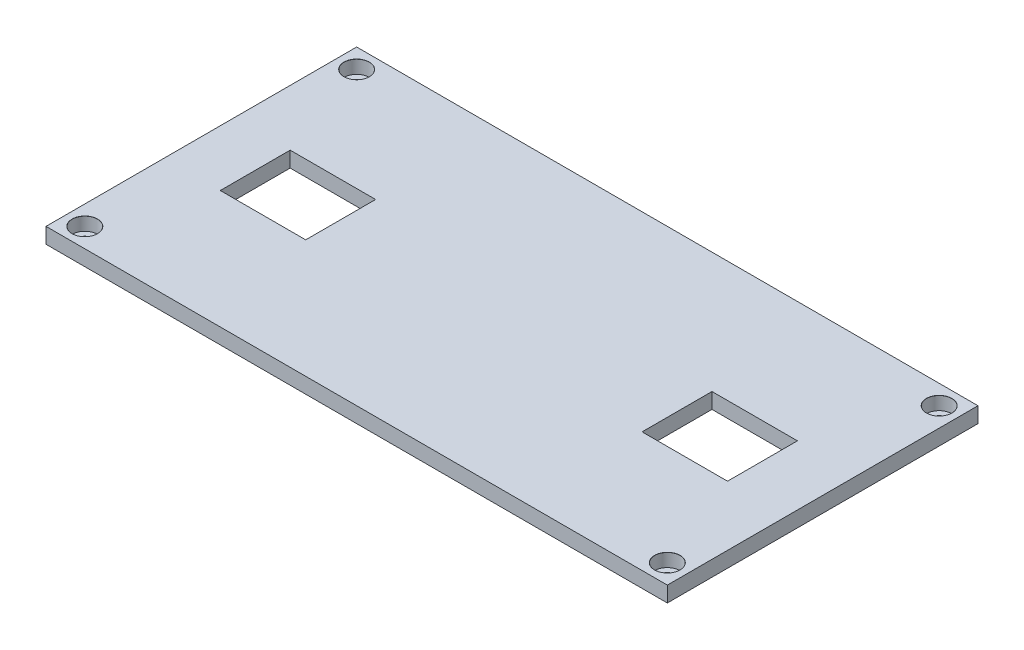
ISO-10303-21;
HEADER;
FILE_DESCRIPTION(('STEP AP214'),'2;1');
FILE_NAME('part.step','',(''),(''),'','','');
FILE_SCHEMA(('AUTOMOTIVE_DESIGN { 1 0 10303 214 1 1 1 1 }'));
ENDSEC;
DATA;
#1=APPLICATION_CONTEXT('core data for automotive mechanical design processes');
#2=APPLICATION_PROTOCOL_DEFINITION('international standard','automotive_design',2000,#1);
#3=PRODUCT_CONTEXT('',#1,'mechanical');
#4=PRODUCT('Part','Part','',(#3));
#5=PRODUCT_RELATED_PRODUCT_CATEGORY('part','',(#4));
#6=PRODUCT_DEFINITION_FORMATION('','',#4);
#7=PRODUCT_DEFINITION_CONTEXT('part definition',#1,'design');
#8=PRODUCT_DEFINITION('design','',#6,#7);
#9=PRODUCT_DEFINITION_SHAPE('','',#8);
#10=(LENGTH_UNIT() NAMED_UNIT(*) SI_UNIT(.MILLI.,.METRE.));
#11=(NAMED_UNIT(*) PLANE_ANGLE_UNIT() SI_UNIT($,.RADIAN.));
#12=(NAMED_UNIT(*) SI_UNIT($,.STERADIAN.) SOLID_ANGLE_UNIT());
#13=UNCERTAINTY_MEASURE_WITH_UNIT(LENGTH_MEASURE(1.E-05),#10,'distance_accuracy_value','');
#14=(GEOMETRIC_REPRESENTATION_CONTEXT(3) GLOBAL_UNCERTAINTY_ASSIGNED_CONTEXT((#13)) GLOBAL_UNIT_ASSIGNED_CONTEXT((#10,
#11,#12)) REPRESENTATION_CONTEXT('',''));
#15=CARTESIAN_POINT('',(0.,0.,0.));
#16=DIRECTION('',(0.,0.,1.));
#17=DIRECTION('',(1.,0.,0.));
#18=AXIS2_PLACEMENT_3D('',#15,#16,#17);
#19=CARTESIAN_POINT('',(-80.,4.,-40.));
#20=DIRECTION('',(0.,0.,-1.));
#21=DIRECTION('',(-1.,0.,0.));
#22=AXIS2_PLACEMENT_3D('',#19,#20,#21);
#23=PLANE('',#22);
#24=DIRECTION('',(1.,0.,0.));
#25=VECTOR('',#24,1.);
#26=CARTESIAN_POINT('',(-80.,0.,-40.));
#27=LINE('',#26,#25);
#28=CARTESIAN_POINT('',(-80.,0.,-40.));
#29=VERTEX_POINT('',#28);
#30=CARTESIAN_POINT('',(80.,0.,-40.));
#31=VERTEX_POINT('',#30);
#32=EDGE_CURVE('E160',#29,#31,#27,.T.);
#33=ORIENTED_EDGE('',*,*,#32,.F.);
#34=DIRECTION('',(0.,-1.,0.));
#35=VECTOR('',#34,1.);
#36=CARTESIAN_POINT('',(-80.,4.,-40.));
#37=LINE('',#36,#35);
#38=CARTESIAN_POINT('',(-80.,4.,-40.));
#39=VERTEX_POINT('',#38);
#40=EDGE_CURVE('E203',#39,#29,#37,.T.);
#41=ORIENTED_EDGE('',*,*,#40,.F.);
#42=DIRECTION('',(1.,0.,0.));
#43=VECTOR('',#42,1.);
#44=CARTESIAN_POINT('',(-80.,4.,-40.));
#45=LINE('',#44,#43);
#46=CARTESIAN_POINT('',(80.,4.,-40.));
#47=VERTEX_POINT('',#46);
#48=EDGE_CURVE('E182',#39,#47,#45,.T.);
#49=ORIENTED_EDGE('',*,*,#48,.T.);
#50=DIRECTION('',(0.,-1.,0.));
#51=VECTOR('',#50,1.);
#52=CARTESIAN_POINT('',(80.,4.,-40.));
#53=LINE('',#52,#51);
#54=EDGE_CURVE('E193',#47,#31,#53,.T.);
#55=ORIENTED_EDGE('',*,*,#54,.T.);
#56=EDGE_LOOP('',(#33,#41,#49,#55));
#57=FACE_BOUND('',#56,.T.);
#58=ADVANCED_FACE('F41',(#57),#23,.T.);
#59=CARTESIAN_POINT('',(-80.,4.,40.));
#60=DIRECTION('',(-1.,0.,0.));
#61=DIRECTION('',(0.,0.,1.));
#62=AXIS2_PLACEMENT_3D('',#59,#60,#61);
#63=PLANE('',#62);
#64=DIRECTION('',(0.,0.,-1.));
#65=VECTOR('',#64,1.);
#66=CARTESIAN_POINT('',(-80.,0.,40.));
#67=LINE('',#66,#65);
#68=CARTESIAN_POINT('',(-80.,0.,40.));
#69=VERTEX_POINT('',#68);
#70=EDGE_CURVE('E186',#69,#29,#67,.T.);
#71=ORIENTED_EDGE('',*,*,#70,.F.);
#72=DIRECTION('',(0.,-1.,0.));
#73=VECTOR('',#72,1.);
#74=CARTESIAN_POINT('',(-80.,4.,40.));
#75=LINE('',#74,#73);
#76=CARTESIAN_POINT('',(-80.,4.,40.));
#77=VERTEX_POINT('',#76);
#78=EDGE_CURVE('E206',#77,#69,#75,.T.);
#79=ORIENTED_EDGE('',*,*,#78,.F.);
#80=DIRECTION('',(0.,0.,-1.));
#81=VECTOR('',#80,1.);
#82=CARTESIAN_POINT('',(-80.,4.,40.));
#83=LINE('',#82,#81);
#84=EDGE_CURVE('E190',#77,#39,#83,.T.);
#85=ORIENTED_EDGE('',*,*,#84,.T.);
#86=ORIENTED_EDGE('',*,*,#40,.T.);
#87=EDGE_LOOP('',(#71,#79,#85,#86));
#88=FACE_BOUND('',#87,.T.);
#89=ADVANCED_FACE('F247',(#88),#63,.T.);
#90=CARTESIAN_POINT('',(-80.,4.,40.));
#91=DIRECTION('',(0.,0.,-1.));
#92=DIRECTION('',(-1.,0.,0.));
#93=AXIS2_PLACEMENT_3D('',#90,#91,#92);
#94=PLANE('',#93);
#95=DIRECTION('',(1.,0.,0.));
#96=VECTOR('',#95,1.);
#97=CARTESIAN_POINT('',(-80.,0.,40.));
#98=LINE('',#97,#96);
#99=CARTESIAN_POINT('',(80.,0.,40.));
#100=VERTEX_POINT('',#99);
#101=EDGE_CURVE('E199',#69,#100,#98,.T.);
#102=ORIENTED_EDGE('',*,*,#101,.T.);
#103=DIRECTION('',(0.,-1.,0.));
#104=VECTOR('',#103,1.);
#105=CARTESIAN_POINT('',(80.,4.,40.));
#106=LINE('',#105,#104);
#107=CARTESIAN_POINT('',(80.,4.,40.));
#108=VERTEX_POINT('',#107);
#109=EDGE_CURVE('E208',#108,#100,#106,.T.);
#110=ORIENTED_EDGE('',*,*,#109,.F.);
#111=DIRECTION('',(1.,0.,0.));
#112=VECTOR('',#111,1.);
#113=CARTESIAN_POINT('',(-80.,4.,40.));
#114=LINE('',#113,#112);
#115=EDGE_CURVE('E188',#77,#108,#114,.T.);
#116=ORIENTED_EDGE('',*,*,#115,.F.);
#117=ORIENTED_EDGE('',*,*,#78,.T.);
#118=EDGE_LOOP('',(#102,#110,#116,#117));
#119=FACE_BOUND('',#118,.T.);
#120=ADVANCED_FACE('F252',(#119),#94,.F.);
#121=CARTESIAN_POINT('',(80.,4.,40.));
#122=DIRECTION('',(-1.,0.,0.));
#123=DIRECTION('',(0.,0.,1.));
#124=AXIS2_PLACEMENT_3D('',#121,#122,#123);
#125=PLANE('',#124);
#126=DIRECTION('',(0.,0.,-1.));
#127=VECTOR('',#126,1.);
#128=CARTESIAN_POINT('',(80.,0.,40.));
#129=LINE('',#128,#127);
#130=EDGE_CURVE('E196',#100,#31,#129,.T.);
#131=ORIENTED_EDGE('',*,*,#130,.T.);
#132=ORIENTED_EDGE('',*,*,#54,.F.);
#133=DIRECTION('',(0.,0.,-1.));
#134=VECTOR('',#133,1.);
#135=CARTESIAN_POINT('',(80.,4.,40.));
#136=LINE('',#135,#134);
#137=EDGE_CURVE('E185',#108,#47,#136,.T.);
#138=ORIENTED_EDGE('',*,*,#137,.F.);
#139=ORIENTED_EDGE('',*,*,#109,.T.);
#140=EDGE_LOOP('',(#131,#132,#138,#139));
#141=FACE_BOUND('',#140,.T.);
#142=ADVANCED_FACE('F268',(#141),#125,.F.);
#143=CARTESIAN_POINT('',(0.,4.,0.));
#144=DIRECTION('',(0.,1.,0.));
#145=DIRECTION('',(0.,0.,1.));
#146=AXIS2_PLACEMENT_3D('',#143,#144,#145);
#147=PLANE('',#146);
#148=CARTESIAN_POINT('',(-75.,4.,-35.));
#149=DIRECTION('',(0.,1.,0.));
#150=DIRECTION('',(0.,0.,1.));
#151=AXIS2_PLACEMENT_3D('',#148,#149,#150);
#152=CIRCLE('',#151,3.275);
#153=CARTESIAN_POINT('',(-75.,4.,-31.725));
#154=VERTEX_POINT('',#153);
#155=EDGE_CURVE('E511',#154,#154,#152,.T.);
#156=ORIENTED_EDGE('',*,*,#155,.F.);
#157=EDGE_LOOP('',(#156));
#158=FACE_BOUND('',#157,.T.);
#159=CARTESIAN_POINT('',(75.,4.,-35.));
#160=DIRECTION('',(0.,1.,0.));
#161=DIRECTION('',(0.,0.,1.));
#162=AXIS2_PLACEMENT_3D('',#159,#160,#161);
#163=CIRCLE('',#162,3.275);
#164=CARTESIAN_POINT('',(75.,4.,-31.725));
#165=VERTEX_POINT('',#164);
#166=EDGE_CURVE('E524',#165,#165,#163,.T.);
#167=ORIENTED_EDGE('',*,*,#166,.F.);
#168=EDGE_LOOP('',(#167));
#169=FACE_BOUND('',#168,.T.);
#170=CARTESIAN_POINT('',(75.,4.,35.));
#171=DIRECTION('',(0.,1.,0.));
#172=DIRECTION('',(0.,0.,1.));
#173=AXIS2_PLACEMENT_3D('',#170,#171,#172);
#174=CIRCLE('',#173,3.275);
#175=CARTESIAN_POINT('',(75.,4.,38.275));
#176=VERTEX_POINT('',#175);
#177=EDGE_CURVE('E539',#176,#176,#174,.T.);
#178=ORIENTED_EDGE('',*,*,#177,.F.);
#179=EDGE_LOOP('',(#178));
#180=FACE_BOUND('',#179,.T.);
#181=CARTESIAN_POINT('',(-75.,4.,35.));
#182=DIRECTION('',(0.,1.,0.));
#183=DIRECTION('',(0.,0.,1.));
#184=AXIS2_PLACEMENT_3D('',#181,#182,#183);
#185=CIRCLE('',#184,3.275);
#186=CARTESIAN_POINT('',(-75.,4.,38.275));
#187=VERTEX_POINT('',#186);
#188=EDGE_CURVE('E554',#187,#187,#185,.T.);
#189=ORIENTED_EDGE('',*,*,#188,.F.);
#190=EDGE_LOOP('',(#189));
#191=FACE_BOUND('',#190,.T.);
#192=DIRECTION('',(0.,0.,-1.));
#193=VECTOR('',#192,1.);
#194=CARTESIAN_POINT('',(-43.5539718881802,4.,9.56827054050187));
#195=LINE('',#194,#193);
#196=CARTESIAN_POINT('',(-43.5539718881802,4.,9.56827054050187));
#197=VERTEX_POINT('',#196);
#198=CARTESIAN_POINT('',(-43.5539718881802,4.,-8.43172945949813));
#199=VERTEX_POINT('',#198);
#200=EDGE_CURVE('E55',#197,#199,#195,.T.);
#201=ORIENTED_EDGE('',*,*,#200,.F.);
#202=DIRECTION('',(1.,0.,0.));
#203=VECTOR('',#202,1.);
#204=CARTESIAN_POINT('',(-43.5539718881802,4.,9.56827054050187));
#205=LINE('',#204,#203);
#206=CARTESIAN_POINT('',(-65.5539718881802,4.,9.56827054050187));
#207=VERTEX_POINT('',#206);
#208=EDGE_CURVE('E153',#207,#197,#205,.T.);
#209=ORIENTED_EDGE('',*,*,#208,.F.);
#210=DIRECTION('',(0.,0.,1.));
#211=VECTOR('',#210,1.);
#212=CARTESIAN_POINT('',(-65.5539718881802,4.,9.56827054050187));
#213=LINE('',#212,#211);
#214=CARTESIAN_POINT('',(-65.5539718881802,4.,-8.43172945949813));
#215=VERTEX_POINT('',#214);
#216=EDGE_CURVE('E136',#215,#207,#213,.T.);
#217=ORIENTED_EDGE('',*,*,#216,.F.);
#218=DIRECTION('',(-1.,0.,0.));
#219=VECTOR('',#218,1.);
#220=CARTESIAN_POINT('',(-43.5539718881802,4.,-8.43172945949813));
#221=LINE('',#220,#219);
#222=EDGE_CURVE('E146',#199,#215,#221,.T.);
#223=ORIENTED_EDGE('',*,*,#222,.F.);
#224=EDGE_LOOP('',(#201,#209,#217,#223));
#225=FACE_BOUND('',#224,.T.);
#226=DIRECTION('',(0.,0.,-1.));
#227=VECTOR('',#226,1.);
#228=CARTESIAN_POINT('',(64.5797938187484,4.,9.08118150578598));
#229=LINE('',#228,#227);
#230=CARTESIAN_POINT('',(64.5797938187484,4.,9.08118150578598));
#231=VERTEX_POINT('',#230);
#232=CARTESIAN_POINT('',(64.5797938187484,4.,-8.91881849421402));
#233=VERTEX_POINT('',#232);
#234=EDGE_CURVE('E63',#231,#233,#229,.T.);
#235=ORIENTED_EDGE('',*,*,#234,.F.);
#236=DIRECTION('',(1.,0.,0.));
#237=VECTOR('',#236,1.);
#238=CARTESIAN_POINT('',(64.5797938187484,4.,9.08118150578598));
#239=LINE('',#238,#237);
#240=CARTESIAN_POINT('',(42.5797938187484,4.,9.08118150578598));
#241=VERTEX_POINT('',#240);
#242=EDGE_CURVE('E165',#241,#231,#239,.T.);
#243=ORIENTED_EDGE('',*,*,#242,.F.);
#244=DIRECTION('',(0.,0.,1.));
#245=VECTOR('',#244,1.);
#246=CARTESIAN_POINT('',(42.5797938187484,4.,9.08118150578598));
#247=LINE('',#246,#245);
#248=CARTESIAN_POINT('',(42.5797938187484,4.,-8.91881849421402));
#249=VERTEX_POINT('',#248);
#250=EDGE_CURVE('E175',#249,#241,#247,.T.);
#251=ORIENTED_EDGE('',*,*,#250,.F.);
#252=DIRECTION('',(-1.,0.,0.));
#253=VECTOR('',#252,1.);
#254=CARTESIAN_POINT('',(64.5797938187484,4.,-8.91881849421402));
#255=LINE('',#254,#253);
#256=EDGE_CURVE('E178',#233,#249,#255,.T.);
#257=ORIENTED_EDGE('',*,*,#256,.F.);
#258=EDGE_LOOP('',(#235,#243,#251,#257));
#259=FACE_BOUND('',#258,.T.);
#260=ORIENTED_EDGE('',*,*,#48,.F.);
#261=ORIENTED_EDGE('',*,*,#84,.F.);
#262=ORIENTED_EDGE('',*,*,#115,.T.);
#263=ORIENTED_EDGE('',*,*,#137,.T.);
#264=EDGE_LOOP('',(#260,#261,#262,#263));
#265=FACE_BOUND('',#264,.T.);
#266=ADVANCED_FACE('F150',(#158,#169,#180,#191,#225,#259,#265),#147,.T.);
#267=CARTESIAN_POINT('',(0.,0.,0.));
#268=DIRECTION('',(0.,1.,0.));
#269=DIRECTION('',(0.,0.,1.));
#270=AXIS2_PLACEMENT_3D('',#267,#268,#269);
#271=PLANE('',#270);
#272=CARTESIAN_POINT('',(-75.,0.,-35.));
#273=DIRECTION('',(0.,1.,0.));
#274=DIRECTION('',(0.,0.,1.));
#275=AXIS2_PLACEMENT_3D('',#272,#273,#274);
#276=CIRCLE('',#275,1.69999999999999);
#277=CARTESIAN_POINT('',(-75.,0.,-33.3));
#278=VERTEX_POINT('',#277);
#279=EDGE_CURVE('E521',#278,#278,#276,.T.);
#280=ORIENTED_EDGE('',*,*,#279,.T.);
#281=EDGE_LOOP('',(#280));
#282=FACE_BOUND('',#281,.T.);
#283=CARTESIAN_POINT('',(75.,0.,-35.));
#284=DIRECTION('',(0.,1.,0.));
#285=DIRECTION('',(0.,0.,1.));
#286=AXIS2_PLACEMENT_3D('',#283,#284,#285);
#287=CIRCLE('',#286,1.69999999999999);
#288=CARTESIAN_POINT('',(75.,0.,-33.3));
#289=VERTEX_POINT('',#288);
#290=EDGE_CURVE('E536',#289,#289,#287,.T.);
#291=ORIENTED_EDGE('',*,*,#290,.T.);
#292=EDGE_LOOP('',(#291));
#293=FACE_BOUND('',#292,.T.);
#294=CARTESIAN_POINT('',(75.,0.,35.));
#295=DIRECTION('',(0.,1.,0.));
#296=DIRECTION('',(0.,0.,1.));
#297=AXIS2_PLACEMENT_3D('',#294,#295,#296);
#298=CIRCLE('',#297,1.69999999999999);
#299=CARTESIAN_POINT('',(75.,0.,36.7));
#300=VERTEX_POINT('',#299);
#301=EDGE_CURVE('E551',#300,#300,#298,.T.);
#302=ORIENTED_EDGE('',*,*,#301,.T.);
#303=EDGE_LOOP('',(#302));
#304=FACE_BOUND('',#303,.T.);
#305=CARTESIAN_POINT('',(-75.,0.,35.));
#306=DIRECTION('',(0.,1.,0.));
#307=DIRECTION('',(0.,0.,1.));
#308=AXIS2_PLACEMENT_3D('',#305,#306,#307);
#309=CIRCLE('',#308,1.69999999999999);
#310=CARTESIAN_POINT('',(-75.,0.,36.7));
#311=VERTEX_POINT('',#310);
#312=EDGE_CURVE('E172',#311,#311,#309,.T.);
#313=ORIENTED_EDGE('',*,*,#312,.T.);
#314=EDGE_LOOP('',(#313));
#315=FACE_BOUND('',#314,.T.);
#316=DIRECTION('',(1.,0.,0.));
#317=VECTOR('',#316,1.);
#318=CARTESIAN_POINT('',(0.,0.,9.56827054050187));
#319=LINE('',#318,#317);
#320=CARTESIAN_POINT('',(-65.5539718881802,0.,9.56827054050187));
#321=VERTEX_POINT('',#320);
#322=CARTESIAN_POINT('',(-43.5539718881802,0.,9.56827054050187));
#323=VERTEX_POINT('',#322);
#324=EDGE_CURVE('E48',#321,#323,#319,.T.);
#325=ORIENTED_EDGE('',*,*,#324,.T.);
#326=DIRECTION('',(0.,0.,-1.));
#327=VECTOR('',#326,1.);
#328=CARTESIAN_POINT('',(-43.5539718881802,0.,0.));
#329=LINE('',#328,#327);
#330=CARTESIAN_POINT('',(-43.5539718881802,0.,-8.43172945949813));
#331=VERTEX_POINT('',#330);
#332=EDGE_CURVE('E11',#323,#331,#329,.T.);
#333=ORIENTED_EDGE('',*,*,#332,.T.);
#334=DIRECTION('',(-1.,0.,0.));
#335=VECTOR('',#334,1.);
#336=CARTESIAN_POINT('',(0.,0.,-8.43172945949813));
#337=LINE('',#336,#335);
#338=CARTESIAN_POINT('',(-65.5539718881802,0.,-8.43172945949813));
#339=VERTEX_POINT('',#338);
#340=EDGE_CURVE('E223',#331,#339,#337,.T.);
#341=ORIENTED_EDGE('',*,*,#340,.T.);
#342=DIRECTION('',(0.,0.,1.));
#343=VECTOR('',#342,1.);
#344=CARTESIAN_POINT('',(-65.5539718881802,0.,0.));
#345=LINE('',#344,#343);
#346=EDGE_CURVE('E139',#339,#321,#345,.T.);
#347=ORIENTED_EDGE('',*,*,#346,.T.);
#348=EDGE_LOOP('',(#325,#333,#341,#347));
#349=FACE_BOUND('',#348,.T.);
#350=DIRECTION('',(1.,0.,0.));
#351=VECTOR('',#350,1.);
#352=CARTESIAN_POINT('',(0.,0.,9.08118150578598));
#353=LINE('',#352,#351);
#354=CARTESIAN_POINT('',(42.5797938187484,0.,9.08118150578598));
#355=VERTEX_POINT('',#354);
#356=CARTESIAN_POINT('',(64.5797938187484,0.,9.08118150578598));
#357=VERTEX_POINT('',#356);
#358=EDGE_CURVE('E217',#355,#357,#353,.T.);
#359=ORIENTED_EDGE('',*,*,#358,.T.);
#360=DIRECTION('',(0.,0.,-1.));
#361=VECTOR('',#360,1.);
#362=CARTESIAN_POINT('',(64.5797938187484,0.,0.));
#363=LINE('',#362,#361);
#364=CARTESIAN_POINT('',(64.5797938187484,0.,-8.91881849421402));
#365=VERTEX_POINT('',#364);
#366=EDGE_CURVE('E220',#357,#365,#363,.T.);
#367=ORIENTED_EDGE('',*,*,#366,.T.);
#368=DIRECTION('',(-1.,0.,0.));
#369=VECTOR('',#368,1.);
#370=CARTESIAN_POINT('',(0.,0.,-8.91881849421402));
#371=LINE('',#370,#369);
#372=CARTESIAN_POINT('',(42.5797938187484,0.,-8.91881849421402));
#373=VERTEX_POINT('',#372);
#374=EDGE_CURVE('E205',#365,#373,#371,.T.);
#375=ORIENTED_EDGE('',*,*,#374,.T.);
#376=DIRECTION('',(0.,0.,1.));
#377=VECTOR('',#376,1.);
#378=CARTESIAN_POINT('',(42.5797938187484,0.,0.));
#379=LINE('',#378,#377);
#380=EDGE_CURVE('E214',#373,#355,#379,.T.);
#381=ORIENTED_EDGE('',*,*,#380,.T.);
#382=EDGE_LOOP('',(#359,#367,#375,#381));
#383=FACE_BOUND('',#382,.T.);
#384=ORIENTED_EDGE('',*,*,#32,.T.);
#385=ORIENTED_EDGE('',*,*,#130,.F.);
#386=ORIENTED_EDGE('',*,*,#101,.F.);
#387=ORIENTED_EDGE('',*,*,#70,.T.);
#388=EDGE_LOOP('',(#384,#385,#386,#387));
#389=FACE_BOUND('',#388,.T.);
#390=ADVANCED_FACE('F227',(#282,#293,#304,#315,#349,#383,#389),#271,.F.);
#391=CARTESIAN_POINT('',(64.5797938187484,-7.,9.08118150578598));
#392=DIRECTION('',(1.,0.,0.));
#393=DIRECTION('',(0.,0.,-1.));
#394=AXIS2_PLACEMENT_3D('',#391,#392,#393);
#395=PLANE('',#394);
#396=DIRECTION('',(0.,1.,0.));
#397=VECTOR('',#396,1.);
#398=CARTESIAN_POINT('',(64.5797938187484,-7.,9.08118150578598));
#399=LINE('',#398,#397);
#400=EDGE_CURVE('E170',#357,#231,#399,.T.);
#401=ORIENTED_EDGE('',*,*,#400,.T.);
#402=ORIENTED_EDGE('',*,*,#234,.T.);
#403=DIRECTION('',(0.,1.,0.));
#404=VECTOR('',#403,1.);
#405=CARTESIAN_POINT('',(64.5797938187484,-7.,-8.91881849421402));
#406=LINE('',#405,#404);
#407=EDGE_CURVE('E163',#365,#233,#406,.T.);
#408=ORIENTED_EDGE('',*,*,#407,.F.);
#409=ORIENTED_EDGE('',*,*,#366,.F.);
#410=EDGE_LOOP('',(#401,#402,#408,#409));
#411=FACE_BOUND('',#410,.T.);
#412=ADVANCED_FACE('F278',(#411),#395,.F.);
#413=CARTESIAN_POINT('',(64.5797938187484,-7.,9.08118150578598));
#414=DIRECTION('',(0.,0.,1.));
#415=DIRECTION('',(1.,0.,0.));
#416=AXIS2_PLACEMENT_3D('',#413,#414,#415);
#417=PLANE('',#416);
#418=DIRECTION('',(0.,1.,0.));
#419=VECTOR('',#418,1.);
#420=CARTESIAN_POINT('',(42.5797938187484,-7.,9.08118150578598));
#421=LINE('',#420,#419);
#422=EDGE_CURVE('E168',#355,#241,#421,.T.);
#423=ORIENTED_EDGE('',*,*,#422,.T.);
#424=ORIENTED_EDGE('',*,*,#242,.T.);
#425=ORIENTED_EDGE('',*,*,#400,.F.);
#426=ORIENTED_EDGE('',*,*,#358,.F.);
#427=EDGE_LOOP('',(#423,#424,#425,#426));
#428=FACE_BOUND('',#427,.T.);
#429=ADVANCED_FACE('F283',(#428),#417,.F.);
#430=CARTESIAN_POINT('',(42.5797938187484,-7.,9.08118150578598));
#431=DIRECTION('',(-1.,0.,0.));
#432=DIRECTION('',(0.,0.,1.));
#433=AXIS2_PLACEMENT_3D('',#430,#431,#432);
#434=PLANE('',#433);
#435=DIRECTION('',(0.,1.,0.));
#436=VECTOR('',#435,1.);
#437=CARTESIAN_POINT('',(42.5797938187484,-7.,-8.91881849421402));
#438=LINE('',#437,#436);
#439=EDGE_CURVE('E166',#373,#249,#438,.T.);
#440=ORIENTED_EDGE('',*,*,#439,.T.);
#441=ORIENTED_EDGE('',*,*,#250,.T.);
#442=ORIENTED_EDGE('',*,*,#422,.F.);
#443=ORIENTED_EDGE('',*,*,#380,.F.);
#444=EDGE_LOOP('',(#440,#441,#442,#443));
#445=FACE_BOUND('',#444,.T.);
#446=ADVANCED_FACE('F241',(#445),#434,.F.);
#447=CARTESIAN_POINT('',(64.5797938187484,-7.,-8.91881849421402));
#448=DIRECTION('',(0.,0.,-1.));
#449=DIRECTION('',(-1.,0.,0.));
#450=AXIS2_PLACEMENT_3D('',#447,#448,#449);
#451=PLANE('',#450);
#452=ORIENTED_EDGE('',*,*,#407,.T.);
#453=ORIENTED_EDGE('',*,*,#256,.T.);
#454=ORIENTED_EDGE('',*,*,#439,.F.);
#455=ORIENTED_EDGE('',*,*,#374,.F.);
#456=EDGE_LOOP('',(#452,#453,#454,#455));
#457=FACE_BOUND('',#456,.T.);
#458=ADVANCED_FACE('F234',(#457),#451,.F.);
#459=CARTESIAN_POINT('',(-43.5539718881802,-7.,9.56827054050187));
#460=DIRECTION('',(1.,0.,0.));
#461=DIRECTION('',(0.,0.,-1.));
#462=AXIS2_PLACEMENT_3D('',#459,#460,#461);
#463=PLANE('',#462);
#464=DIRECTION('',(0.,1.,0.));
#465=VECTOR('',#464,1.);
#466=CARTESIAN_POINT('',(-43.5539718881802,-7.,9.56827054050187));
#467=LINE('',#466,#465);
#468=EDGE_CURVE('E158',#323,#197,#467,.T.);
#469=ORIENTED_EDGE('',*,*,#468,.T.);
#470=ORIENTED_EDGE('',*,*,#200,.T.);
#471=DIRECTION('',(0.,1.,0.));
#472=VECTOR('',#471,1.);
#473=CARTESIAN_POINT('',(-43.5539718881802,-7.,-8.43172945949813));
#474=LINE('',#473,#472);
#475=EDGE_CURVE('E143',#331,#199,#474,.T.);
#476=ORIENTED_EDGE('',*,*,#475,.F.);
#477=ORIENTED_EDGE('',*,*,#332,.F.);
#478=EDGE_LOOP('',(#469,#470,#476,#477));
#479=FACE_BOUND('',#478,.T.);
#480=ADVANCED_FACE('F232',(#479),#463,.F.);
#481=CARTESIAN_POINT('',(-43.5539718881802,-7.,9.56827054050187));
#482=DIRECTION('',(0.,0.,1.));
#483=DIRECTION('',(1.,0.,0.));
#484=AXIS2_PLACEMENT_3D('',#481,#482,#483);
#485=PLANE('',#484);
#486=DIRECTION('',(0.,1.,0.));
#487=VECTOR('',#486,1.);
#488=CARTESIAN_POINT('',(-65.5539718881802,-7.,9.56827054050187));
#489=LINE('',#488,#487);
#490=EDGE_CURVE('E142',#321,#207,#489,.T.);
#491=ORIENTED_EDGE('',*,*,#490,.T.);
#492=ORIENTED_EDGE('',*,*,#208,.T.);
#493=ORIENTED_EDGE('',*,*,#468,.F.);
#494=ORIENTED_EDGE('',*,*,#324,.F.);
#495=EDGE_LOOP('',(#491,#492,#493,#494));
#496=FACE_BOUND('',#495,.T.);
#497=ADVANCED_FACE('F231',(#496),#485,.F.);
#498=CARTESIAN_POINT('',(-65.5539718881802,-7.,9.56827054050187));
#499=DIRECTION('',(-1.,0.,0.));
#500=DIRECTION('',(0.,0.,1.));
#501=AXIS2_PLACEMENT_3D('',#498,#499,#500);
#502=PLANE('',#501);
#503=DIRECTION('',(0.,1.,0.));
#504=VECTOR('',#503,1.);
#505=CARTESIAN_POINT('',(-65.5539718881802,-7.,-8.43172945949813));
#506=LINE('',#505,#504);
#507=EDGE_CURVE('E131',#339,#215,#506,.T.);
#508=ORIENTED_EDGE('',*,*,#507,.T.);
#509=ORIENTED_EDGE('',*,*,#216,.T.);
#510=ORIENTED_EDGE('',*,*,#490,.F.);
#511=ORIENTED_EDGE('',*,*,#346,.F.);
#512=EDGE_LOOP('',(#508,#509,#510,#511));
#513=FACE_BOUND('',#512,.T.);
#514=ADVANCED_FACE('F133',(#513),#502,.F.);
#515=CARTESIAN_POINT('',(-43.5539718881802,-7.,-8.43172945949813));
#516=DIRECTION('',(0.,0.,-1.));
#517=DIRECTION('',(-1.,0.,0.));
#518=AXIS2_PLACEMENT_3D('',#515,#516,#517);
#519=PLANE('',#518);
#520=ORIENTED_EDGE('',*,*,#475,.T.);
#521=ORIENTED_EDGE('',*,*,#222,.T.);
#522=ORIENTED_EDGE('',*,*,#507,.F.);
#523=ORIENTED_EDGE('',*,*,#340,.F.);
#524=EDGE_LOOP('',(#520,#521,#522,#523));
#525=FACE_BOUND('',#524,.T.);
#526=ADVANCED_FACE('F147',(#525),#519,.F.);
#527=CARTESIAN_POINT('',(-75.,4.,35.));
#528=DIRECTION('',(0.,1.,0.));
#529=DIRECTION('',(0.,0.,1.));
#530=AXIS2_PLACEMENT_3D('',#527,#528,#529);
#531=CYLINDRICAL_SURFACE('',#530,1.69999999999999);
#532=ORIENTED_EDGE('',*,*,#312,.F.);
#533=EDGE_LOOP('',(#532));
#534=FACE_BOUND('',#533,.T.);
#535=CARTESIAN_POINT('',(-75.,0.600000000000001,35.));
#536=DIRECTION('',(0.,1.,0.));
#537=DIRECTION('',(0.,0.,1.));
#538=AXIS2_PLACEMENT_3D('',#535,#536,#537);
#539=CIRCLE('',#538,1.69999999999999);
#540=CARTESIAN_POINT('',(-75.,0.600000000000001,36.7));
#541=VERTEX_POINT('',#540);
#542=EDGE_CURVE('E563',#541,#541,#539,.T.);
#543=ORIENTED_EDGE('',*,*,#542,.T.);
#544=EDGE_LOOP('',(#543));
#545=FACE_BOUND('',#544,.T.);
#546=ADVANCED_FACE('F344',(#534,#545),#531,.F.);
#547=CARTESIAN_POINT('',(-71.75,0.600000000000001,35.));
#548=DIRECTION('',(0.,-1.,0.));
#549=DIRECTION('',(0.,0.,-1.));
#550=AXIS2_PLACEMENT_3D('',#547,#548,#549);
#551=PLANE('',#550);
#552=ORIENTED_EDGE('',*,*,#542,.F.);
#553=EDGE_LOOP('',(#552));
#554=FACE_BOUND('',#553,.T.);
#555=CARTESIAN_POINT('',(-75.,0.600000000000001,35.));
#556=DIRECTION('',(0.,1.,0.));
#557=DIRECTION('',(0.,0.,1.));
#558=AXIS2_PLACEMENT_3D('',#555,#556,#557);
#559=CIRCLE('',#558,3.25);
#560=CARTESIAN_POINT('',(-75.,0.600000000000001,38.25));
#561=VERTEX_POINT('',#560);
#562=EDGE_CURVE('E560',#561,#561,#559,.T.);
#563=ORIENTED_EDGE('',*,*,#562,.T.);
#564=EDGE_LOOP('',(#563));
#565=FACE_BOUND('',#564,.T.);
#566=ADVANCED_FACE('F352',(#554,#565),#551,.F.);
#567=CARTESIAN_POINT('',(-75.,4.,35.));
#568=DIRECTION('',(0.,1.,0.));
#569=DIRECTION('',(0.,0.,1.));
#570=AXIS2_PLACEMENT_3D('',#567,#568,#569);
#571=CYLINDRICAL_SURFACE('',#570,3.25);
#572=ORIENTED_EDGE('',*,*,#562,.F.);
#573=EDGE_LOOP('',(#572));
#574=FACE_BOUND('',#573,.T.);
#575=CARTESIAN_POINT('',(-75.,3.975,35.));
#576=DIRECTION('',(0.,1.,0.));
#577=DIRECTION('',(0.,0.,1.));
#578=AXIS2_PLACEMENT_3D('',#575,#576,#577);
#579=CIRCLE('',#578,3.25);
#580=CARTESIAN_POINT('',(-75.,3.975,38.25));
#581=VERTEX_POINT('',#580);
#582=EDGE_CURVE('E557',#581,#581,#579,.T.);
#583=ORIENTED_EDGE('',*,*,#582,.T.);
#584=EDGE_LOOP('',(#583));
#585=FACE_BOUND('',#584,.T.);
#586=ADVANCED_FACE('F362',(#574,#585),#571,.F.);
#587=CARTESIAN_POINT('',(-75.,4.,35.));
#588=DIRECTION('',(0.,1.,0.));
#589=DIRECTION('',(0.,0.,1.));
#590=AXIS2_PLACEMENT_3D('',#587,#588,#589);
#591=CONICAL_SURFACE('',#590,3.275,0.785398163397379);
#592=ORIENTED_EDGE('',*,*,#582,.F.);
#593=EDGE_LOOP('',(#592));
#594=FACE_BOUND('',#593,.T.);
#595=ORIENTED_EDGE('',*,*,#188,.T.);
#596=EDGE_LOOP('',(#595));
#597=FACE_BOUND('',#596,.T.);
#598=ADVANCED_FACE('F372',(#594,#597),#591,.F.);
#599=CARTESIAN_POINT('',(75.,4.,35.));
#600=DIRECTION('',(0.,1.,0.));
#601=DIRECTION('',(0.,0.,1.));
#602=AXIS2_PLACEMENT_3D('',#599,#600,#601);
#603=CYLINDRICAL_SURFACE('',#602,1.69999999999999);
#604=ORIENTED_EDGE('',*,*,#301,.F.);
#605=EDGE_LOOP('',(#604));
#606=FACE_BOUND('',#605,.T.);
#607=CARTESIAN_POINT('',(75.,0.600000000000001,35.));
#608=DIRECTION('',(0.,1.,0.));
#609=DIRECTION('',(0.,0.,1.));
#610=AXIS2_PLACEMENT_3D('',#607,#608,#609);
#611=CIRCLE('',#610,1.69999999999999);
#612=CARTESIAN_POINT('',(75.,0.600000000000001,36.7));
#613=VERTEX_POINT('',#612);
#614=EDGE_CURVE('E548',#613,#613,#611,.T.);
#615=ORIENTED_EDGE('',*,*,#614,.T.);
#616=EDGE_LOOP('',(#615));
#617=FACE_BOUND('',#616,.T.);
#618=ADVANCED_FACE('F382',(#606,#617),#603,.F.);
#619=CARTESIAN_POINT('',(78.25,0.600000000000001,35.));
#620=DIRECTION('',(0.,-1.,0.));
#621=DIRECTION('',(0.,0.,-1.));
#622=AXIS2_PLACEMENT_3D('',#619,#620,#621);
#623=PLANE('',#622);
#624=ORIENTED_EDGE('',*,*,#614,.F.);
#625=EDGE_LOOP('',(#624));
#626=FACE_BOUND('',#625,.T.);
#627=CARTESIAN_POINT('',(75.,0.600000000000001,35.));
#628=DIRECTION('',(0.,1.,0.));
#629=DIRECTION('',(0.,0.,1.));
#630=AXIS2_PLACEMENT_3D('',#627,#628,#629);
#631=CIRCLE('',#630,3.25);
#632=CARTESIAN_POINT('',(75.,0.600000000000001,38.25));
#633=VERTEX_POINT('',#632);
#634=EDGE_CURVE('E545',#633,#633,#631,.T.);
#635=ORIENTED_EDGE('',*,*,#634,.T.);
#636=EDGE_LOOP('',(#635));
#637=FACE_BOUND('',#636,.T.);
#638=ADVANCED_FACE('F392',(#626,#637),#623,.F.);
#639=CARTESIAN_POINT('',(75.,4.,35.));
#640=DIRECTION('',(0.,1.,0.));
#641=DIRECTION('',(0.,0.,1.));
#642=AXIS2_PLACEMENT_3D('',#639,#640,#641);
#643=CYLINDRICAL_SURFACE('',#642,3.25);
#644=ORIENTED_EDGE('',*,*,#634,.F.);
#645=EDGE_LOOP('',(#644));
#646=FACE_BOUND('',#645,.T.);
#647=CARTESIAN_POINT('',(75.,3.975,35.));
#648=DIRECTION('',(0.,1.,0.));
#649=DIRECTION('',(0.,0.,1.));
#650=AXIS2_PLACEMENT_3D('',#647,#648,#649);
#651=CIRCLE('',#650,3.25);
#652=CARTESIAN_POINT('',(75.,3.975,38.25));
#653=VERTEX_POINT('',#652);
#654=EDGE_CURVE('E542',#653,#653,#651,.T.);
#655=ORIENTED_EDGE('',*,*,#654,.T.);
#656=EDGE_LOOP('',(#655));
#657=FACE_BOUND('',#656,.T.);
#658=ADVANCED_FACE('F402',(#646,#657),#643,.F.);
#659=CARTESIAN_POINT('',(75.,4.,35.));
#660=DIRECTION('',(0.,1.,0.));
#661=DIRECTION('',(0.,0.,1.));
#662=AXIS2_PLACEMENT_3D('',#659,#660,#661);
#663=CONICAL_SURFACE('',#662,3.275,0.785398163397379);
#664=ORIENTED_EDGE('',*,*,#654,.F.);
#665=EDGE_LOOP('',(#664));
#666=FACE_BOUND('',#665,.T.);
#667=ORIENTED_EDGE('',*,*,#177,.T.);
#668=EDGE_LOOP('',(#667));
#669=FACE_BOUND('',#668,.T.);
#670=ADVANCED_FACE('F412',(#666,#669),#663,.F.);
#671=CARTESIAN_POINT('',(75.,4.,-35.));
#672=DIRECTION('',(0.,1.,0.));
#673=DIRECTION('',(0.,0.,1.));
#674=AXIS2_PLACEMENT_3D('',#671,#672,#673);
#675=CYLINDRICAL_SURFACE('',#674,1.69999999999999);
#676=ORIENTED_EDGE('',*,*,#290,.F.);
#677=EDGE_LOOP('',(#676));
#678=FACE_BOUND('',#677,.T.);
#679=CARTESIAN_POINT('',(75.,0.600000000000001,-35.));
#680=DIRECTION('',(0.,1.,0.));
#681=DIRECTION('',(0.,0.,1.));
#682=AXIS2_PLACEMENT_3D('',#679,#680,#681);
#683=CIRCLE('',#682,1.69999999999999);
#684=CARTESIAN_POINT('',(75.,0.600000000000001,-33.3));
#685=VERTEX_POINT('',#684);
#686=EDGE_CURVE('E533',#685,#685,#683,.T.);
#687=ORIENTED_EDGE('',*,*,#686,.T.);
#688=EDGE_LOOP('',(#687));
#689=FACE_BOUND('',#688,.T.);
#690=ADVANCED_FACE('F422',(#678,#689),#675,.F.);
#691=CARTESIAN_POINT('',(78.25,0.600000000000001,-35.));
#692=DIRECTION('',(0.,-1.,0.));
#693=DIRECTION('',(0.,0.,-1.));
#694=AXIS2_PLACEMENT_3D('',#691,#692,#693);
#695=PLANE('',#694);
#696=ORIENTED_EDGE('',*,*,#686,.F.);
#697=EDGE_LOOP('',(#696));
#698=FACE_BOUND('',#697,.T.);
#699=CARTESIAN_POINT('',(75.,0.600000000000001,-35.));
#700=DIRECTION('',(0.,1.,0.));
#701=DIRECTION('',(0.,0.,1.));
#702=AXIS2_PLACEMENT_3D('',#699,#700,#701);
#703=CIRCLE('',#702,3.25);
#704=CARTESIAN_POINT('',(75.,0.600000000000001,-31.75));
#705=VERTEX_POINT('',#704);
#706=EDGE_CURVE('E530',#705,#705,#703,.T.);
#707=ORIENTED_EDGE('',*,*,#706,.T.);
#708=EDGE_LOOP('',(#707));
#709=FACE_BOUND('',#708,.T.);
#710=ADVANCED_FACE('F432',(#698,#709),#695,.F.);
#711=CARTESIAN_POINT('',(75.,4.,-35.));
#712=DIRECTION('',(0.,1.,0.));
#713=DIRECTION('',(0.,0.,1.));
#714=AXIS2_PLACEMENT_3D('',#711,#712,#713);
#715=CYLINDRICAL_SURFACE('',#714,3.25);
#716=ORIENTED_EDGE('',*,*,#706,.F.);
#717=EDGE_LOOP('',(#716));
#718=FACE_BOUND('',#717,.T.);
#719=CARTESIAN_POINT('',(75.,3.975,-35.));
#720=DIRECTION('',(0.,1.,0.));
#721=DIRECTION('',(0.,0.,1.));
#722=AXIS2_PLACEMENT_3D('',#719,#720,#721);
#723=CIRCLE('',#722,3.25);
#724=CARTESIAN_POINT('',(75.,3.975,-31.75));
#725=VERTEX_POINT('',#724);
#726=EDGE_CURVE('E527',#725,#725,#723,.T.);
#727=ORIENTED_EDGE('',*,*,#726,.T.);
#728=EDGE_LOOP('',(#727));
#729=FACE_BOUND('',#728,.T.);
#730=ADVANCED_FACE('F442',(#718,#729),#715,.F.);
#731=CARTESIAN_POINT('',(75.,4.,-35.));
#732=DIRECTION('',(0.,1.,0.));
#733=DIRECTION('',(0.,0.,1.));
#734=AXIS2_PLACEMENT_3D('',#731,#732,#733);
#735=CONICAL_SURFACE('',#734,3.275,0.785398163397379);
#736=ORIENTED_EDGE('',*,*,#726,.F.);
#737=EDGE_LOOP('',(#736));
#738=FACE_BOUND('',#737,.T.);
#739=ORIENTED_EDGE('',*,*,#166,.T.);
#740=EDGE_LOOP('',(#739));
#741=FACE_BOUND('',#740,.T.);
#742=ADVANCED_FACE('F452',(#738,#741),#735,.F.);
#743=CARTESIAN_POINT('',(-75.,4.,-35.));
#744=DIRECTION('',(0.,1.,0.));
#745=DIRECTION('',(0.,0.,1.));
#746=AXIS2_PLACEMENT_3D('',#743,#744,#745);
#747=CYLINDRICAL_SURFACE('',#746,1.69999999999999);
#748=ORIENTED_EDGE('',*,*,#279,.F.);
#749=EDGE_LOOP('',(#748));
#750=FACE_BOUND('',#749,.T.);
#751=CARTESIAN_POINT('',(-75.,0.600000000000001,-35.));
#752=DIRECTION('',(0.,1.,0.));
#753=DIRECTION('',(0.,0.,1.));
#754=AXIS2_PLACEMENT_3D('',#751,#752,#753);
#755=CIRCLE('',#754,1.69999999999999);
#756=CARTESIAN_POINT('',(-75.,0.600000000000001,-33.3));
#757=VERTEX_POINT('',#756);
#758=EDGE_CURVE('E518',#757,#757,#755,.T.);
#759=ORIENTED_EDGE('',*,*,#758,.T.);
#760=EDGE_LOOP('',(#759));
#761=FACE_BOUND('',#760,.T.);
#762=ADVANCED_FACE('F462',(#750,#761),#747,.F.);
#763=CARTESIAN_POINT('',(-71.75,0.600000000000001,-35.));
#764=DIRECTION('',(0.,-1.,0.));
#765=DIRECTION('',(0.,0.,-1.));
#766=AXIS2_PLACEMENT_3D('',#763,#764,#765);
#767=PLANE('',#766);
#768=ORIENTED_EDGE('',*,*,#758,.F.);
#769=EDGE_LOOP('',(#768));
#770=FACE_BOUND('',#769,.T.);
#771=CARTESIAN_POINT('',(-75.,0.600000000000001,-35.));
#772=DIRECTION('',(0.,1.,0.));
#773=DIRECTION('',(0.,0.,1.));
#774=AXIS2_PLACEMENT_3D('',#771,#772,#773);
#775=CIRCLE('',#774,3.25);
#776=CARTESIAN_POINT('',(-75.,0.600000000000001,-31.75));
#777=VERTEX_POINT('',#776);
#778=EDGE_CURVE('E513',#777,#777,#775,.T.);
#779=ORIENTED_EDGE('',*,*,#778,.T.);
#780=EDGE_LOOP('',(#779));
#781=FACE_BOUND('',#780,.T.);
#782=ADVANCED_FACE('F472',(#770,#781),#767,.F.);
#783=CARTESIAN_POINT('',(-75.,4.,-35.));
#784=DIRECTION('',(0.,1.,0.));
#785=DIRECTION('',(0.,0.,1.));
#786=AXIS2_PLACEMENT_3D('',#783,#784,#785);
#787=CYLINDRICAL_SURFACE('',#786,3.25);
#788=ORIENTED_EDGE('',*,*,#778,.F.);
#789=EDGE_LOOP('',(#788));
#790=FACE_BOUND('',#789,.T.);
#791=CARTESIAN_POINT('',(-75.,3.975,-35.));
#792=DIRECTION('',(0.,1.,0.));
#793=DIRECTION('',(0.,0.,1.));
#794=AXIS2_PLACEMENT_3D('',#791,#792,#793);
#795=CIRCLE('',#794,3.25);
#796=CARTESIAN_POINT('',(-75.,3.975,-31.75));
#797=VERTEX_POINT('',#796);
#798=EDGE_CURVE('E508',#797,#797,#795,.T.);
#799=ORIENTED_EDGE('',*,*,#798,.T.);
#800=EDGE_LOOP('',(#799));
#801=FACE_BOUND('',#800,.T.);
#802=ADVANCED_FACE('F482',(#790,#801),#787,.F.);
#803=CARTESIAN_POINT('',(-75.,4.,-35.));
#804=DIRECTION('',(0.,1.,0.));
#805=DIRECTION('',(0.,0.,1.));
#806=AXIS2_PLACEMENT_3D('',#803,#804,#805);
#807=CONICAL_SURFACE('',#806,3.275,0.785398163397379);
#808=ORIENTED_EDGE('',*,*,#798,.F.);
#809=EDGE_LOOP('',(#808));
#810=FACE_BOUND('',#809,.T.);
#811=ORIENTED_EDGE('',*,*,#155,.T.);
#812=EDGE_LOOP('',(#811));
#813=FACE_BOUND('',#812,.T.);
#814=ADVANCED_FACE('F492',(#810,#813),#807,.F.);
#815=CLOSED_SHELL('',(#58,#89,#120,#142,#266,#390,#412,#429,#446,#458,#480,#497,#514,#526,#546,
#566,#586,#598,#618,#638,#658,#670,#690,#710,#730,#742,#762,#782,#802,#814));
#816=MANIFOLD_SOLID_BREP('B2',#815);
#817=ADVANCED_BREP_SHAPE_REPRESENTATION('',(#18,#816),#14);
#818=SHAPE_DEFINITION_REPRESENTATION(#9,#817);
ENDSEC;
END-ISO-10303-21;
